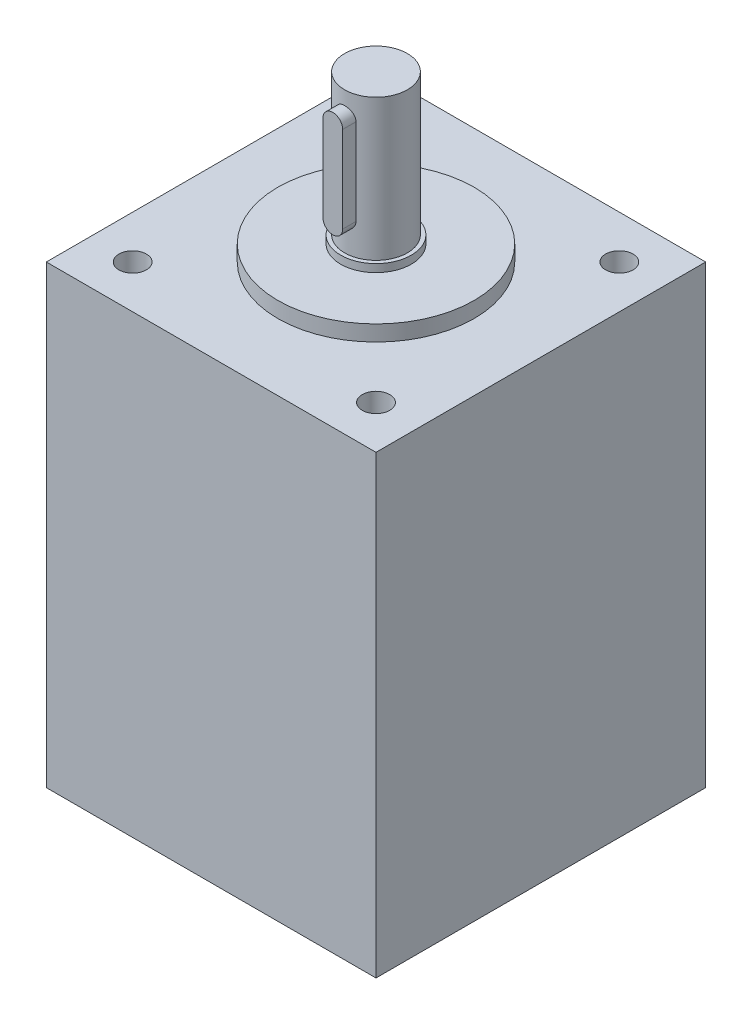
ISO-10303-21;
HEADER;
FILE_DESCRIPTION(('STEP AP214'),'2;1');
FILE_NAME('part.step','',(''),(''),'','','');
FILE_SCHEMA(('AUTOMOTIVE_DESIGN { 1 0 10303 214 1 1 1 1 }'));
ENDSEC;
DATA;
#1=APPLICATION_CONTEXT('core data for automotive mechanical design processes');
#2=APPLICATION_PROTOCOL_DEFINITION('international standard','automotive_design',2000,#1);
#3=PRODUCT_CONTEXT('',#1,'mechanical');
#4=PRODUCT('Part','Part','',(#3));
#5=PRODUCT_RELATED_PRODUCT_CATEGORY('part','',(#4));
#6=PRODUCT_DEFINITION_FORMATION('','',#4);
#7=PRODUCT_DEFINITION_CONTEXT('part definition',#1,'design');
#8=PRODUCT_DEFINITION('design','',#6,#7);
#9=PRODUCT_DEFINITION_SHAPE('','',#8);
#10=(LENGTH_UNIT() NAMED_UNIT(*) SI_UNIT(.MILLI.,.METRE.));
#11=(NAMED_UNIT(*) PLANE_ANGLE_UNIT() SI_UNIT($,.RADIAN.));
#12=(NAMED_UNIT(*) SI_UNIT($,.STERADIAN.) SOLID_ANGLE_UNIT());
#13=UNCERTAINTY_MEASURE_WITH_UNIT(LENGTH_MEASURE(1.E-05),#10,'distance_accuracy_value','');
#14=(GEOMETRIC_REPRESENTATION_CONTEXT(3) GLOBAL_UNCERTAINTY_ASSIGNED_CONTEXT((#13)) GLOBAL_UNIT_ASSIGNED_CONTEXT((#10,
#11,#12)) REPRESENTATION_CONTEXT('',''));
#15=CARTESIAN_POINT('',(0.,0.,0.));
#16=DIRECTION('',(0.,0.,1.));
#17=DIRECTION('',(1.,0.,0.));
#18=AXIS2_PLACEMENT_3D('',#15,#16,#17);
#19=CARTESIAN_POINT('',(0.,58.,0.));
#20=DIRECTION('',(1.,0.,0.));
#21=DIRECTION('',(0.,0.,-1.));
#22=AXIS2_PLACEMENT_3D('',#19,#20,#21);
#23=PLANE('',#22);
#24=DIRECTION('',(0.,0.,1.));
#25=VECTOR('',#24,1.);
#26=CARTESIAN_POINT('',(0.,0.,0.));
#27=LINE('',#26,#25);
#28=CARTESIAN_POINT('',(0.,0.,-42.));
#29=VERTEX_POINT('',#28);
#30=CARTESIAN_POINT('',(0.,0.,0.));
#31=VERTEX_POINT('',#30);
#32=EDGE_CURVE('E164',#29,#31,#27,.T.);
#33=ORIENTED_EDGE('',*,*,#32,.T.);
#34=DIRECTION('',(0.,-1.,0.));
#35=VECTOR('',#34,1.);
#36=CARTESIAN_POINT('',(0.,58.,0.));
#37=LINE('',#36,#35);
#38=CARTESIAN_POINT('',(0.,58.,0.));
#39=VERTEX_POINT('',#38);
#40=EDGE_CURVE('E167',#39,#31,#37,.T.);
#41=ORIENTED_EDGE('',*,*,#40,.F.);
#42=DIRECTION('',(0.,0.,1.));
#43=VECTOR('',#42,1.);
#44=CARTESIAN_POINT('',(0.,58.,0.));
#45=LINE('',#44,#43);
#46=CARTESIAN_POINT('',(0.,58.,-42.));
#47=VERTEX_POINT('',#46);
#48=EDGE_CURVE('E168',#47,#39,#45,.T.);
#49=ORIENTED_EDGE('',*,*,#48,.F.);
#50=DIRECTION('',(0.,-1.,0.));
#51=VECTOR('',#50,1.);
#52=CARTESIAN_POINT('',(0.,58.,-42.));
#53=LINE('',#52,#51);
#54=EDGE_CURVE('E174',#47,#29,#53,.T.);
#55=ORIENTED_EDGE('',*,*,#54,.T.);
#56=EDGE_LOOP('',(#33,#41,#49,#55));
#57=FACE_BOUND('',#56,.T.);
#58=ADVANCED_FACE('F38',(#57),#23,.F.);
#59=CARTESIAN_POINT('',(0.,58.,0.));
#60=DIRECTION('',(0.,0.,-1.));
#61=DIRECTION('',(-1.,0.,0.));
#62=AXIS2_PLACEMENT_3D('',#59,#60,#61);
#63=PLANE('',#62);
#64=DIRECTION('',(1.,0.,0.));
#65=VECTOR('',#64,1.);
#66=CARTESIAN_POINT('',(0.,0.,0.));
#67=LINE('',#66,#65);
#68=CARTESIAN_POINT('',(42.,0.,0.));
#69=VERTEX_POINT('',#68);
#70=EDGE_CURVE('E177',#31,#69,#67,.T.);
#71=ORIENTED_EDGE('',*,*,#70,.T.);
#72=DIRECTION('',(0.,-1.,0.));
#73=VECTOR('',#72,1.);
#74=CARTESIAN_POINT('',(42.,58.,0.));
#75=LINE('',#74,#73);
#76=CARTESIAN_POINT('',(42.,58.,0.));
#77=VERTEX_POINT('',#76);
#78=EDGE_CURVE('E185',#77,#69,#75,.T.);
#79=ORIENTED_EDGE('',*,*,#78,.F.);
#80=DIRECTION('',(1.,0.,0.));
#81=VECTOR('',#80,1.);
#82=CARTESIAN_POINT('',(0.,58.,0.));
#83=LINE('',#82,#81);
#84=EDGE_CURVE('E92',#39,#77,#83,.T.);
#85=ORIENTED_EDGE('',*,*,#84,.F.);
#86=ORIENTED_EDGE('',*,*,#40,.T.);
#87=EDGE_LOOP('',(#71,#79,#85,#86));
#88=FACE_BOUND('',#87,.T.);
#89=ADVANCED_FACE('F251',(#88),#63,.F.);
#90=CARTESIAN_POINT('',(42.,58.,0.));
#91=DIRECTION('',(-1.,0.,0.));
#92=DIRECTION('',(0.,0.,1.));
#93=AXIS2_PLACEMENT_3D('',#90,#91,#92);
#94=PLANE('',#93);
#95=DIRECTION('',(0.,0.,-1.));
#96=VECTOR('',#95,1.);
#97=CARTESIAN_POINT('',(42.,0.,0.));
#98=LINE('',#97,#96);
#99=CARTESIAN_POINT('',(42.,0.,-42.));
#100=VERTEX_POINT('',#99);
#101=EDGE_CURVE('E179',#69,#100,#98,.T.);
#102=ORIENTED_EDGE('',*,*,#101,.T.);
#103=DIRECTION('',(0.,-1.,0.));
#104=VECTOR('',#103,1.);
#105=CARTESIAN_POINT('',(42.,58.,-42.));
#106=LINE('',#105,#104);
#107=CARTESIAN_POINT('',(42.,58.,-42.));
#108=VERTEX_POINT('',#107);
#109=EDGE_CURVE('E183',#108,#100,#106,.T.);
#110=ORIENTED_EDGE('',*,*,#109,.F.);
#111=DIRECTION('',(0.,0.,-1.));
#112=VECTOR('',#111,1.);
#113=CARTESIAN_POINT('',(42.,58.,0.));
#114=LINE('',#113,#112);
#115=EDGE_CURVE('E171',#77,#108,#114,.T.);
#116=ORIENTED_EDGE('',*,*,#115,.F.);
#117=ORIENTED_EDGE('',*,*,#78,.T.);
#118=EDGE_LOOP('',(#102,#110,#116,#117));
#119=FACE_BOUND('',#118,.T.);
#120=ADVANCED_FACE('F250',(#119),#94,.F.);
#121=CARTESIAN_POINT('',(0.,58.,-42.));
#122=DIRECTION('',(0.,0.,1.));
#123=DIRECTION('',(1.,0.,0.));
#124=AXIS2_PLACEMENT_3D('',#121,#122,#123);
#125=PLANE('',#124);
#126=DIRECTION('',(-1.,0.,0.));
#127=VECTOR('',#126,1.);
#128=CARTESIAN_POINT('',(0.,0.,-42.));
#129=LINE('',#128,#127);
#130=EDGE_CURVE('E84',#100,#29,#129,.T.);
#131=ORIENTED_EDGE('',*,*,#130,.T.);
#132=ORIENTED_EDGE('',*,*,#54,.F.);
#133=DIRECTION('',(-1.,0.,0.));
#134=VECTOR('',#133,1.);
#135=CARTESIAN_POINT('',(0.,58.,-42.));
#136=LINE('',#135,#134);
#137=EDGE_CURVE('E63',#108,#47,#136,.T.);
#138=ORIENTED_EDGE('',*,*,#137,.F.);
#139=ORIENTED_EDGE('',*,*,#109,.T.);
#140=EDGE_LOOP('',(#131,#132,#138,#139));
#141=FACE_BOUND('',#140,.T.);
#142=ADVANCED_FACE('F246',(#141),#125,.F.);
#143=CARTESIAN_POINT('',(0.,58.,0.));
#144=DIRECTION('',(0.,-1.,0.));
#145=DIRECTION('',(0.,0.,-1.));
#146=AXIS2_PLACEMENT_3D('',#143,#144,#145);
#147=PLANE('',#146);
#148=CARTESIAN_POINT('',(5.5,58.,-5.50000000000001));
#149=DIRECTION('',(0.,1.,0.));
#150=DIRECTION('',(0.,0.,-1.));
#151=AXIS2_PLACEMENT_3D('',#148,#149,#150);
#152=CIRCLE('',#151,1.75);
#153=CARTESIAN_POINT('',(5.5,58.,-7.25000000000001));
#154=VERTEX_POINT('',#153);
#155=EDGE_CURVE('E483',#154,#154,#152,.T.);
#156=ORIENTED_EDGE('',*,*,#155,.F.);
#157=EDGE_LOOP('',(#156));
#158=FACE_BOUND('',#157,.T.);
#159=CARTESIAN_POINT('',(36.5,58.,-5.50000000000001));
#160=DIRECTION('',(0.,1.,0.));
#161=DIRECTION('',(0.,0.,1.));
#162=AXIS2_PLACEMENT_3D('',#159,#160,#161);
#163=CIRCLE('',#162,1.75);
#164=CARTESIAN_POINT('',(36.5,58.,-3.75000000000001));
#165=VERTEX_POINT('',#164);
#166=EDGE_CURVE('E484',#165,#165,#163,.T.);
#167=ORIENTED_EDGE('',*,*,#166,.F.);
#168=EDGE_LOOP('',(#167));
#169=FACE_BOUND('',#168,.T.);
#170=CARTESIAN_POINT('',(36.5,58.,-36.5));
#171=DIRECTION('',(0.,1.,0.));
#172=DIRECTION('',(0.,0.,-1.));
#173=AXIS2_PLACEMENT_3D('',#170,#171,#172);
#174=CIRCLE('',#173,1.75);
#175=CARTESIAN_POINT('',(36.5,58.,-38.25));
#176=VERTEX_POINT('',#175);
#177=EDGE_CURVE('E486',#176,#176,#174,.T.);
#178=ORIENTED_EDGE('',*,*,#177,.F.);
#179=EDGE_LOOP('',(#178));
#180=FACE_BOUND('',#179,.T.);
#181=CARTESIAN_POINT('',(5.5,58.,-36.5));
#182=DIRECTION('',(0.,1.,0.));
#183=DIRECTION('',(0.,0.,1.));
#184=AXIS2_PLACEMENT_3D('',#181,#182,#183);
#185=CIRCLE('',#184,1.75);
#186=CARTESIAN_POINT('',(5.5,58.,-34.75));
#187=VERTEX_POINT('',#186);
#188=EDGE_CURVE('E137',#187,#187,#185,.T.);
#189=ORIENTED_EDGE('',*,*,#188,.F.);
#190=EDGE_LOOP('',(#189));
#191=FACE_BOUND('',#190,.T.);
#192=CARTESIAN_POINT('',(21.,58.,-21.));
#193=DIRECTION('',(0.,1.,0.));
#194=DIRECTION('',(0.,0.,1.));
#195=AXIS2_PLACEMENT_3D('',#192,#193,#194);
#196=CIRCLE('',#195,12.5);
#197=CARTESIAN_POINT('',(21.,58.,-8.50000000000001));
#198=VERTEX_POINT('',#197);
#199=EDGE_CURVE('E161',#198,#198,#196,.T.);
#200=ORIENTED_EDGE('',*,*,#199,.F.);
#201=EDGE_LOOP('',(#200));
#202=FACE_BOUND('',#201,.T.);
#203=ORIENTED_EDGE('',*,*,#48,.T.);
#204=ORIENTED_EDGE('',*,*,#84,.T.);
#205=ORIENTED_EDGE('',*,*,#115,.T.);
#206=ORIENTED_EDGE('',*,*,#137,.T.);
#207=EDGE_LOOP('',(#203,#204,#205,#206));
#208=FACE_BOUND('',#207,.T.);
#209=ADVANCED_FACE('F234',(#158,#169,#180,#191,#202,#208),#147,.F.);
#210=CARTESIAN_POINT('',(0.,0.,0.));
#211=DIRECTION('',(0.,-1.,0.));
#212=DIRECTION('',(0.,0.,-1.));
#213=AXIS2_PLACEMENT_3D('',#210,#211,#212);
#214=PLANE('',#213);
#215=CARTESIAN_POINT('',(5.5,0.,-5.50000000000001));
#216=DIRECTION('',(0.,-1.,0.));
#217=DIRECTION('',(0.,0.,-1.));
#218=AXIS2_PLACEMENT_3D('',#215,#216,#217);
#219=CIRCLE('',#218,1.75);
#220=CARTESIAN_POINT('',(5.5,0.,-7.25000000000001));
#221=VERTEX_POINT('',#220);
#222=EDGE_CURVE('E41',#221,#221,#219,.T.);
#223=ORIENTED_EDGE('',*,*,#222,.F.);
#224=EDGE_LOOP('',(#223));
#225=FACE_BOUND('',#224,.T.);
#226=CARTESIAN_POINT('',(36.5,0.,-5.50000000000001));
#227=DIRECTION('',(0.,-1.,0.));
#228=DIRECTION('',(0.,0.,-1.));
#229=AXIS2_PLACEMENT_3D('',#226,#227,#228);
#230=CIRCLE('',#229,1.75);
#231=CARTESIAN_POINT('',(36.5,0.,-7.25000000000002));
#232=VERTEX_POINT('',#231);
#233=EDGE_CURVE('E135',#232,#232,#230,.T.);
#234=ORIENTED_EDGE('',*,*,#233,.F.);
#235=EDGE_LOOP('',(#234));
#236=FACE_BOUND('',#235,.T.);
#237=CARTESIAN_POINT('',(36.5,0.,-36.5));
#238=DIRECTION('',(0.,-1.,0.));
#239=DIRECTION('',(0.,0.,-1.));
#240=AXIS2_PLACEMENT_3D('',#237,#238,#239);
#241=CIRCLE('',#240,1.75);
#242=CARTESIAN_POINT('',(36.5,0.,-38.25));
#243=VERTEX_POINT('',#242);
#244=EDGE_CURVE('E222',#243,#243,#241,.T.);
#245=ORIENTED_EDGE('',*,*,#244,.F.);
#246=EDGE_LOOP('',(#245));
#247=FACE_BOUND('',#246,.T.);
#248=CARTESIAN_POINT('',(5.5,0.,-36.5));
#249=DIRECTION('',(0.,-1.,0.));
#250=DIRECTION('',(0.,0.,-1.));
#251=AXIS2_PLACEMENT_3D('',#248,#249,#250);
#252=CIRCLE('',#251,1.75);
#253=CARTESIAN_POINT('',(5.5,0.,-38.25));
#254=VERTEX_POINT('',#253);
#255=EDGE_CURVE('E219',#254,#254,#252,.T.);
#256=ORIENTED_EDGE('',*,*,#255,.F.);
#257=EDGE_LOOP('',(#256));
#258=FACE_BOUND('',#257,.T.);
#259=ORIENTED_EDGE('',*,*,#32,.F.);
#260=ORIENTED_EDGE('',*,*,#130,.F.);
#261=ORIENTED_EDGE('',*,*,#101,.F.);
#262=ORIENTED_EDGE('',*,*,#70,.F.);
#263=EDGE_LOOP('',(#259,#260,#261,#262));
#264=FACE_BOUND('',#263,.T.);
#265=ADVANCED_FACE('F230',(#225,#236,#247,#258,#264),#214,.T.);
#266=CARTESIAN_POINT('',(21.,60.,-21.));
#267=DIRECTION('',(0.,-1.,0.));
#268=DIRECTION('',(0.,0.,-1.));
#269=AXIS2_PLACEMENT_3D('',#266,#267,#268);
#270=CYLINDRICAL_SURFACE('',#269,12.5);
#271=CARTESIAN_POINT('',(21.,60.,-21.));
#272=DIRECTION('',(0.,1.,0.));
#273=DIRECTION('',(0.,0.,1.));
#274=AXIS2_PLACEMENT_3D('',#271,#272,#273);
#275=CIRCLE('',#274,12.5);
#276=CARTESIAN_POINT('',(21.,60.,-8.50000000000001));
#277=VERTEX_POINT('',#276);
#278=EDGE_CURVE('E158',#277,#277,#275,.T.);
#279=ORIENTED_EDGE('',*,*,#278,.F.);
#280=EDGE_LOOP('',(#279));
#281=FACE_BOUND('',#280,.T.);
#282=ORIENTED_EDGE('',*,*,#199,.T.);
#283=EDGE_LOOP('',(#282));
#284=FACE_BOUND('',#283,.T.);
#285=ADVANCED_FACE('F233',(#281,#284),#270,.T.);
#286=CARTESIAN_POINT('',(21.,60.,-21.));
#287=DIRECTION('',(0.,1.,0.));
#288=DIRECTION('',(0.,0.,1.));
#289=AXIS2_PLACEMENT_3D('',#286,#287,#288);
#290=PLANE('',#289);
#291=CARTESIAN_POINT('',(21.,60.,-21.));
#292=DIRECTION('',(0.,1.,0.));
#293=DIRECTION('',(0.,0.,1.));
#294=AXIS2_PLACEMENT_3D('',#291,#292,#293);
#295=CIRCLE('',#294,4.5);
#296=CARTESIAN_POINT('',(21.,60.,-16.5));
#297=VERTEX_POINT('',#296);
#298=EDGE_CURVE('E155',#297,#297,#295,.T.);
#299=ORIENTED_EDGE('',*,*,#298,.F.);
#300=EDGE_LOOP('',(#299));
#301=FACE_BOUND('',#300,.T.);
#302=ORIENTED_EDGE('',*,*,#278,.T.);
#303=EDGE_LOOP('',(#302));
#304=FACE_BOUND('',#303,.T.);
#305=ADVANCED_FACE('F266',(#301,#304),#290,.T.);
#306=CARTESIAN_POINT('',(21.,61.,-21.));
#307=DIRECTION('',(0.,-1.,0.));
#308=DIRECTION('',(0.,0.,-1.));
#309=AXIS2_PLACEMENT_3D('',#306,#307,#308);
#310=CYLINDRICAL_SURFACE('',#309,4.5);
#311=CARTESIAN_POINT('',(21.,61.,-21.));
#312=DIRECTION('',(0.,1.,0.));
#313=DIRECTION('',(0.,0.,1.));
#314=AXIS2_PLACEMENT_3D('',#311,#312,#313);
#315=CIRCLE('',#314,4.5);
#316=CARTESIAN_POINT('',(21.,61.,-16.5));
#317=VERTEX_POINT('',#316);
#318=EDGE_CURVE('E150',#317,#317,#315,.T.);
#319=ORIENTED_EDGE('',*,*,#318,.F.);
#320=EDGE_LOOP('',(#319));
#321=FACE_BOUND('',#320,.T.);
#322=ORIENTED_EDGE('',*,*,#298,.T.);
#323=EDGE_LOOP('',(#322));
#324=FACE_BOUND('',#323,.T.);
#325=ADVANCED_FACE('F270',(#321,#324),#310,.T.);
#326=CARTESIAN_POINT('',(21.,61.,-21.));
#327=DIRECTION('',(0.,1.,0.));
#328=DIRECTION('',(0.,0.,1.));
#329=AXIS2_PLACEMENT_3D('',#326,#327,#328);
#330=PLANE('',#329);
#331=CARTESIAN_POINT('',(21.,61.,-21.));
#332=DIRECTION('',(0.,1.,0.));
#333=DIRECTION('',(0.,0.,1.));
#334=AXIS2_PLACEMENT_3D('',#331,#332,#333);
#335=CIRCLE('',#334,4.);
#336=CARTESIAN_POINT('',(21.,61.,-17.));
#337=VERTEX_POINT('',#336);
#338=EDGE_CURVE('E151',#337,#337,#335,.T.);
#339=ORIENTED_EDGE('',*,*,#338,.F.);
#340=EDGE_LOOP('',(#339));
#341=FACE_BOUND('',#340,.T.);
#342=ORIENTED_EDGE('',*,*,#318,.T.);
#343=EDGE_LOOP('',(#342));
#344=FACE_BOUND('',#343,.T.);
#345=ADVANCED_FACE('F273',(#341,#344),#330,.T.);
#346=CARTESIAN_POINT('',(21.,79.,-21.));
#347=DIRECTION('',(0.,-1.,0.));
#348=DIRECTION('',(0.,0.,-1.));
#349=AXIS2_PLACEMENT_3D('',#346,#347,#348);
#350=CYLINDRICAL_SURFACE('',#349,4.);
#351=DIRECTION('',(0.,-1.,0.));
#352=VECTOR('',#351,1.);
#353=CARTESIAN_POINT('',(19.7451485693752,79.,-17.2019283989031));
#354=LINE('',#353,#352);
#355=CARTESIAN_POINT('',(19.7451485693752,65.,-17.2019283989031));
#356=VERTEX_POINT('',#355);
#357=CARTESIAN_POINT('',(19.7451485693752,76.,-17.2019283989031));
#358=VERTEX_POINT('',#357);
#359=EDGE_CURVE('E154',#356,#358,#354,.F.);
#360=ORIENTED_EDGE('',*,*,#359,.T.);
#361=CARTESIAN_POINT('',(22.2548514306248,76.,-17.2019283989031));
#362=CARTESIAN_POINT('',(22.2548510076971,75.9314025017575,-17.2019280077231));
#363=CARTESIAN_POINT('',(22.2492074284182,75.8628006628783,-17.2000496435417));
#364=CARTESIAN_POINT('',(22.2268474559461,75.7276133721323,-17.1927726795756));
#365=CARTESIAN_POINT('',(22.2101281390364,75.6610284575376,-17.1873731502975));
#366=CARTESIAN_POINT('',(22.1662489106781,75.5318528530891,-17.1737243018151));
#367=CARTESIAN_POINT('',(22.1391075850232,75.4692552828904,-17.1654800582899));
#368=CARTESIAN_POINT('',(22.0752168839291,75.3494845430403,-17.1470777698554));
#369=CARTESIAN_POINT('',(22.0384657861454,75.2923123482766,-17.1369193819683));
#370=CARTESIAN_POINT('',(21.9550361559735,75.1830359044051,-17.1154389447144));
#371=CARTESIAN_POINT('',(21.9080821753213,75.1311471150295,-17.1040903747683));
#372=CARTESIAN_POINT('',(21.8061689498582,75.0358358278152,-17.0817338479075));
#373=CARTESIAN_POINT('',(21.7512085800784,74.9924145217415,-17.0707259391227));
#374=CARTESIAN_POINT('',(21.6332928394617,74.9143184815162,-17.0499874575148));
#375=CARTESIAN_POINT('',(21.5701836942455,74.8798658565649,-17.0402917494172));
#376=CARTESIAN_POINT('',(21.4387106836485,74.8221479407846,-17.0235799666477));
#377=CARTESIAN_POINT('',(21.3703480679716,74.7988799988219,-17.0165632570474));
#378=CARTESIAN_POINT('',(21.2325648254133,74.7649119803921,-17.0061877891637));
#379=CARTESIAN_POINT('',(21.1632431993916,74.7538435991747,-17.0027220699658));
#380=CARTESIAN_POINT('',(21.0236459387936,74.7434217159415,-16.999461199698));
#381=CARTESIAN_POINT('',(20.9533705264032,74.744065530816,-16.999665207942));
#382=CARTESIAN_POINT('',(20.8164535609773,74.756807970105,-17.0036464425257));
#383=CARTESIAN_POINT('',(20.7497706445706,74.7685072917916,-17.0072991063602));
#384=CARTESIAN_POINT('',(20.6193674707329,74.8023731692894,-17.0176138544112));
#385=CARTESIAN_POINT('',(20.5556474073189,74.8245404095161,-17.0242761354017));
#386=CARTESIAN_POINT('',(20.432060158524,74.8789680950992,-17.0400282618756));
#387=CARTESIAN_POINT('',(20.3722499759235,74.9113492841755,-17.0491469468435));
#388=CARTESIAN_POINT('',(20.2587884107593,74.9851886756804,-17.0688517778303));
#389=CARTESIAN_POINT('',(20.2051386001482,75.0266491870835,-17.0794382968843));
#390=CARTESIAN_POINT('',(20.1031400182846,75.1195182445489,-17.1014771269303));
#391=CARTESIAN_POINT('',(20.055108359805,75.1712713601979,-17.1129471269657));
#392=CARTESIAN_POINT('',(19.9683107849442,75.2822046100731,-17.1350771168726));
#393=CARTESIAN_POINT('',(19.9295459776963,75.3413856320411,-17.1457370096797));
#394=CARTESIAN_POINT('',(19.8620096670831,75.4663968644005,-17.1651295014488));
#395=CARTESIAN_POINT('',(19.8333565281485,75.5322948931996,-17.1738388630348));
#396=CARTESIAN_POINT('',(19.7876538502749,75.6683198209031,-17.1880718212862));
#397=CARTESIAN_POINT('',(19.770600103765,75.7384451763252,-17.193596573028));
#398=CARTESIAN_POINT('',(19.749194000783,75.877894044525,-17.2005781028202));
#399=CARTESIAN_POINT('',(19.7443556979977,75.9471352187903,-17.2021904158905));
#400=CARTESIAN_POINT('',(19.746152925018,76.0854451603328,-17.2015965125429));
#401=CARTESIAN_POINT('',(19.7527866649873,76.1545139528208,-17.1993908917885));
#402=CARTESIAN_POINT('',(19.776905245254,76.2884197871557,-17.1915632820957));
#403=CARTESIAN_POINT('',(19.7940674212281,76.3533215080429,-17.1860429809193));
#404=CARTESIAN_POINT('',(19.8383763975075,76.4793165771696,-17.1723159824303));
#405=CARTESIAN_POINT('',(19.8655248346307,76.5404092991666,-17.1641088447509));
#406=CARTESIAN_POINT('',(19.9299295046433,76.6590033055538,-17.1456389428064));
#407=CARTESIAN_POINT('',(19.9674548061946,76.7163500822858,-17.1353236945109));
#408=CARTESIAN_POINT('',(20.0512344075225,76.824109596224,-17.1139081134519));
#409=CARTESIAN_POINT('',(20.0974909923903,76.8745205122398,-17.1028075756446));
#410=CARTESIAN_POINT('',(20.1997207128226,76.9691520380372,-17.0805105083099));
#411=CARTESIAN_POINT('',(20.2560192664983,77.0130256571187,-17.069329374103));
#412=CARTESIAN_POINT('',(20.3754503269506,77.0907169550484,-17.0485944700002));
#413=CARTESIAN_POINT('',(20.4385825236713,77.124535089873,-17.0390406263216));
#414=CARTESIAN_POINT('',(20.5695034918161,77.1808315622422,-17.0226908626561));
#415=CARTESIAN_POINT('',(20.6372545091695,77.2033916487806,-17.0158751329105));
#416=CARTESIAN_POINT('',(20.7758408653886,77.236721343425,-17.0056824773655));
#417=CARTESIAN_POINT('',(20.8466752234608,77.2474946727442,-17.0023044662628));
#418=CARTESIAN_POINT('',(20.9862246139922,77.2566408687772,-16.9994403370757));
#419=CARTESIAN_POINT('',(21.0549039679829,77.2555147645122,-16.9997969650812));
#420=CARTESIAN_POINT('',(21.1910506492713,77.2421070599648,-17.0039847833683));
#421=CARTESIAN_POINT('',(21.2585180563407,77.2298261966646,-17.0078157441045));
#422=CARTESIAN_POINT('',(21.3894838197575,77.1947774241575,-17.0184715606523));
#423=CARTESIAN_POINT('',(21.4530216745938,77.1721445537192,-17.025257812596));
#424=CARTESIAN_POINT('',(21.5754284967597,77.1171563652379,-17.0411244598342));
#425=CARTESIAN_POINT('',(21.6342966581051,77.0847993734165,-17.0502052500366));
#426=CARTESIAN_POINT('',(21.7478776277273,77.0100056062433,-17.0700994405475));
#427=CARTESIAN_POINT('',(21.8023802756065,76.9672627253126,-17.0809613650403));
#428=CARTESIAN_POINT('',(21.9036055976567,76.8734492709564,-17.1030542309684));
#429=CARTESIAN_POINT('',(21.9503259267689,76.8223761965225,-17.1142852824171));
#430=CARTESIAN_POINT('',(22.0362388012747,76.7113037862435,-17.1362913214459));
#431=CARTESIAN_POINT('',(22.0751271052061,76.6510629291876,-17.147038468921));
#432=CARTESIAN_POINT('',(22.1421863838066,76.5245770440211,-17.1663809587386));
#433=CARTESIAN_POINT('',(22.1703616100532,76.4583344107186,-17.174977154241));
#434=CARTESIAN_POINT('',(22.213186728485,76.3273761895562,-17.1883546710163));
#435=CARTESIAN_POINT('',(22.2287648079051,76.2629898639875,-17.1933933222814));
#436=CARTESIAN_POINT('',(22.2495960656978,76.1324033998949,-17.2001799615079));
#437=CARTESIAN_POINT('',(22.2548518387942,76.066203721438,-17.2019287764326));
#438=CARTESIAN_POINT('',(22.2548514306248,76.,-17.2019283989031));
#439=B_SPLINE_CURVE_WITH_KNOTS('',3,(#361,#362,#363,#364,#365,#366,#367,#368,#369,#370,#371,
#372,#373,#374,#375,#376,#377,#378,#379,#380,#381,#382,#383,#384,#385,#386,#387,#388,#389,#390,
#391,#392,#393,#394,#395,#396,#397,#398,#399,#400,#401,#402,#403,#404,#405,#406,#407,#408,#409,
#410,#411,#412,#413,#414,#415,#416,#417,#418,#419,#420,#421,#422,#423,#424,#425,#426,#427,#428,
#429,#430,#431,#432,#433,#434,#435,#436,#437,#438),.UNSPECIFIED.,.T.,.F.,(4,2,2,2,2,2,2,2,2,2,2,
2,2,2,2,2,2,2,2,2,2,2,2,2,2,2,2,2,2,2,2,2,2,2,2,2,2,2,4),(0.,0.205547907287991,
0.411150095691636,0.616387319412504,0.821661352726282,1.03337996507,1.24512835450256,
1.46170688178864,1.67823404757303,1.8880282091795,2.09777431031727,2.30022315004717,
2.50268522816052,2.70763655035462,2.91264005464588,3.12625017021235,3.33988583961746,
3.55594522568433,3.77192619637699,3.97916923987075,4.18637995280127,4.38753723665012,
4.58872750628429,4.79572341095838,5.00277356447217,5.21848151715834,5.43417968685104,
5.64828793055633,5.86232855833277,6.06739411849258,6.27244613118721,6.47489640423646,
6.67738154430628,6.88677168468945,7.09622480725021,7.31268731379779,7.52906382544084,
7.72748882201965,7.92586393401221),.UNSPECIFIED.);
#440=CARTESIAN_POINT('',(22.2548514306248,76.,-17.2019283989031));
#441=VERTEX_POINT('',#440);
#442=EDGE_CURVE('E11',#358,#441,#439,.T.);
#443=ORIENTED_EDGE('',*,*,#442,.T.);
#444=DIRECTION('',(0.,-1.,0.));
#445=VECTOR('',#444,1.);
#446=CARTESIAN_POINT('',(22.2548514306248,79.,-17.2019283989031));
#447=LINE('',#446,#445);
#448=CARTESIAN_POINT('',(22.2548514306248,65.,-17.2019283989031));
#449=VERTEX_POINT('',#448);
#450=EDGE_CURVE('E46',#441,#449,#447,.T.);
#451=ORIENTED_EDGE('',*,*,#450,.T.);
#452=CARTESIAN_POINT('',(22.2548514306248,65.,-17.2019283989031));
#453=CARTESIAN_POINT('',(22.2548510076971,64.9314025017576,-17.2019280077231));
#454=CARTESIAN_POINT('',(22.2492074284182,64.8628006628783,-17.2000496435417));
#455=CARTESIAN_POINT('',(22.2268474559461,64.7276133721323,-17.1927726795756));
#456=CARTESIAN_POINT('',(22.2101281390364,64.6610284575376,-17.1873731502975));
#457=CARTESIAN_POINT('',(22.1662489106781,64.5318528530891,-17.1737243018151));
#458=CARTESIAN_POINT('',(22.1391075850232,64.4692552828904,-17.1654800582899));
#459=CARTESIAN_POINT('',(22.0752168839291,64.3494845430403,-17.1470777698554));
#460=CARTESIAN_POINT('',(22.0384657861454,64.2923123482766,-17.1369193819683));
#461=CARTESIAN_POINT('',(21.9550361559735,64.1830359044051,-17.1154389447144));
#462=CARTESIAN_POINT('',(21.9080821753213,64.1311471150295,-17.1040903747683));
#463=CARTESIAN_POINT('',(21.8061689498582,64.0358358278152,-17.0817338479075));
#464=CARTESIAN_POINT('',(21.7512085800784,63.9924145217415,-17.0707259391227));
#465=CARTESIAN_POINT('',(21.6332928394617,63.9143184815163,-17.0499874575148));
#466=CARTESIAN_POINT('',(21.5701836942455,63.8798658565649,-17.0402917494172));
#467=CARTESIAN_POINT('',(21.4387106836485,63.8221479407846,-17.0235799666477));
#468=CARTESIAN_POINT('',(21.3703480679716,63.7988799988219,-17.0165632570474));
#469=CARTESIAN_POINT('',(21.2325648254133,63.7649119803921,-17.0061877891637));
#470=CARTESIAN_POINT('',(21.1632431993916,63.7538435991747,-17.0027220699658));
#471=CARTESIAN_POINT('',(21.0236459387936,63.7434217159415,-16.999461199698));
#472=CARTESIAN_POINT('',(20.9533705264032,63.744065530816,-16.999665207942));
#473=CARTESIAN_POINT('',(20.8164535609773,63.756807970105,-17.0036464425257));
#474=CARTESIAN_POINT('',(20.7497706445706,63.7685072917916,-17.0072991063602));
#475=CARTESIAN_POINT('',(20.6193674707329,63.8023731692894,-17.0176138544112));
#476=CARTESIAN_POINT('',(20.5556474073189,63.8245404095161,-17.0242761354017));
#477=CARTESIAN_POINT('',(20.432060158524,63.8789680950992,-17.0400282618756));
#478=CARTESIAN_POINT('',(20.3722499759235,63.9113492841755,-17.0491469468435));
#479=CARTESIAN_POINT('',(20.2587884107593,63.9851886756804,-17.0688517778303));
#480=CARTESIAN_POINT('',(20.2051386001482,64.0266491870835,-17.0794382968843));
#481=CARTESIAN_POINT('',(20.1031400182846,64.1195182445489,-17.1014771269303));
#482=CARTESIAN_POINT('',(20.0551083598051,64.1712713601979,-17.1129471269657));
#483=CARTESIAN_POINT('',(19.9683107849442,64.2822046100731,-17.1350771168726));
#484=CARTESIAN_POINT('',(19.9295459776963,64.3413856320411,-17.1457370096797));
#485=CARTESIAN_POINT('',(19.8620096670831,64.4663968644005,-17.1651295014488));
#486=CARTESIAN_POINT('',(19.8333565281485,64.5322948931996,-17.1738388630348));
#487=CARTESIAN_POINT('',(19.7876538502749,64.6683198209031,-17.1880718212862));
#488=CARTESIAN_POINT('',(19.770600103765,64.7384451763252,-17.193596573028));
#489=CARTESIAN_POINT('',(19.749194000783,64.877894044525,-17.2005781028202));
#490=CARTESIAN_POINT('',(19.7443556979977,64.9471352187903,-17.2021904158905));
#491=CARTESIAN_POINT('',(19.746152925018,65.0854451603328,-17.2015965125429));
#492=CARTESIAN_POINT('',(19.7527866649874,65.1545139528208,-17.1993908917885));
#493=CARTESIAN_POINT('',(19.776905245254,65.2884197871557,-17.1915632820957));
#494=CARTESIAN_POINT('',(19.7940674212281,65.3533215080429,-17.1860429809193));
#495=CARTESIAN_POINT('',(19.8383763975075,65.4793165771696,-17.1723159824303));
#496=CARTESIAN_POINT('',(19.8655248346307,65.5404092991666,-17.1641088447509));
#497=CARTESIAN_POINT('',(19.9299295046433,65.6590033055538,-17.1456389428064));
#498=CARTESIAN_POINT('',(19.9674548061946,65.7163500822859,-17.1353236945109));
#499=CARTESIAN_POINT('',(20.0512344075225,65.824109596224,-17.1139081134519));
#500=CARTESIAN_POINT('',(20.0974909923903,65.8745205122398,-17.1028075756446));
#501=CARTESIAN_POINT('',(20.1997207128226,65.9691520380372,-17.0805105083099));
#502=CARTESIAN_POINT('',(20.2560192664983,66.0130256571187,-17.069329374103));
#503=CARTESIAN_POINT('',(20.3754503269506,66.0907169550484,-17.0485944700002));
#504=CARTESIAN_POINT('',(20.4385825236713,66.124535089873,-17.0390406263216));
#505=CARTESIAN_POINT('',(20.5695034918161,66.1808315622422,-17.0226908626561));
#506=CARTESIAN_POINT('',(20.6372545091695,66.2033916487806,-17.0158751329105));
#507=CARTESIAN_POINT('',(20.7758408653886,66.236721343425,-17.0056824773655));
#508=CARTESIAN_POINT('',(20.8466752234608,66.2474946727442,-17.0023044662628));
#509=CARTESIAN_POINT('',(20.9862246139922,66.2566408687772,-16.9994403370757));
#510=CARTESIAN_POINT('',(21.0549039679829,66.2555147645122,-16.9997969650812));
#511=CARTESIAN_POINT('',(21.1910506492713,66.2421070599648,-17.0039847833683));
#512=CARTESIAN_POINT('',(21.2585180563407,66.2298261966646,-17.0078157441045));
#513=CARTESIAN_POINT('',(21.3894838197575,66.1947774241575,-17.0184715606523));
#514=CARTESIAN_POINT('',(21.4530216745938,66.1721445537192,-17.025257812596));
#515=CARTESIAN_POINT('',(21.5754284967597,66.1171563652379,-17.0411244598342));
#516=CARTESIAN_POINT('',(21.6342966581051,66.0847993734165,-17.0502052500366));
#517=CARTESIAN_POINT('',(21.7478776277273,66.0100056062433,-17.0700994405475));
#518=CARTESIAN_POINT('',(21.8023802756065,65.9672627253126,-17.0809613650403));
#519=CARTESIAN_POINT('',(21.9036055976567,65.8734492709564,-17.1030542309684));
#520=CARTESIAN_POINT('',(21.9503259267689,65.8223761965225,-17.1142852824171));
#521=CARTESIAN_POINT('',(22.0362388012747,65.7113037862435,-17.1362913214459));
#522=CARTESIAN_POINT('',(22.0751271052061,65.6510629291876,-17.147038468921));
#523=CARTESIAN_POINT('',(22.1421863838066,65.5245770440211,-17.1663809587386));
#524=CARTESIAN_POINT('',(22.1703616100532,65.4583344107186,-17.174977154241));
#525=CARTESIAN_POINT('',(22.213186728485,65.3273761895562,-17.1883546710163));
#526=CARTESIAN_POINT('',(22.2287648079051,65.2629898639875,-17.1933933222814));
#527=CARTESIAN_POINT('',(22.2495960656978,65.132403399895,-17.2001799615079));
#528=CARTESIAN_POINT('',(22.2548518387942,65.066203721438,-17.2019287764326));
#529=CARTESIAN_POINT('',(22.2548514306248,65.,-17.2019283989031));
#530=B_SPLINE_CURVE_WITH_KNOTS('',3,(#452,#453,#454,#455,#456,#457,#458,#459,#460,#461,#462,
#463,#464,#465,#466,#467,#468,#469,#470,#471,#472,#473,#474,#475,#476,#477,#478,#479,#480,#481,
#482,#483,#484,#485,#486,#487,#488,#489,#490,#491,#492,#493,#494,#495,#496,#497,#498,#499,#500,
#501,#502,#503,#504,#505,#506,#507,#508,#509,#510,#511,#512,#513,#514,#515,#516,#517,#518,#519,
#520,#521,#522,#523,#524,#525,#526,#527,#528,#529),.UNSPECIFIED.,.T.,.F.,(4,2,2,2,2,2,2,2,2,2,2,
2,2,2,2,2,2,2,2,2,2,2,2,2,2,2,2,2,2,2,2,2,2,2,2,2,2,2,4),(0.,0.205547907287977,
0.411150095691636,0.616387319412519,0.821661352726282,1.03337996507,1.24512835450256,
1.46170688178864,1.67823404757303,1.88802820917949,2.09777431031726,2.30022315004717,
2.50268522816051,2.70763655035462,2.91264005464587,3.12625017021234,3.33988583961746,
3.55594522568433,3.77192619637699,3.97916923987076,4.18637995280126,4.3875372366501,
4.58872750628428,4.79572341095837,5.00277356447216,5.21848151715833,5.43417968685104,
5.64828793055633,5.86232855833276,6.06739411849257,6.27244613118721,6.47489640423646,
6.67738154430627,6.88677168468944,7.09622480725021,7.31268731379778,7.52906382544083,
7.72748882201963,7.92586393401221),.UNSPECIFIED.);
#531=EDGE_CURVE('E190',#449,#356,#530,.T.);
#532=ORIENTED_EDGE('',*,*,#531,.T.);
#533=EDGE_LOOP('',(#360,#443,#451,#532));
#534=FACE_BOUND('',#533,.T.);
#535=CARTESIAN_POINT('',(21.,79.,-21.));
#536=DIRECTION('',(0.,1.,0.));
#537=DIRECTION('',(0.,0.,1.));
#538=AXIS2_PLACEMENT_3D('',#535,#536,#537);
#539=CIRCLE('',#538,4.);
#540=CARTESIAN_POINT('',(21.,79.,-17.));
#541=VERTEX_POINT('',#540);
#542=EDGE_CURVE('E144',#541,#541,#539,.T.);
#543=ORIENTED_EDGE('',*,*,#542,.F.);
#544=EDGE_LOOP('',(#543));
#545=FACE_BOUND('',#544,.T.);
#546=ORIENTED_EDGE('',*,*,#338,.T.);
#547=EDGE_LOOP('',(#546));
#548=FACE_BOUND('',#547,.T.);
#549=ADVANCED_FACE('F198',(#534,#545,#548),#350,.T.);
#550=CARTESIAN_POINT('',(21.,79.,-21.));
#551=DIRECTION('',(0.,1.,0.));
#552=DIRECTION('',(0.,0.,1.));
#553=AXIS2_PLACEMENT_3D('',#550,#551,#552);
#554=PLANE('',#553);
#555=ORIENTED_EDGE('',*,*,#542,.T.);
#556=EDGE_LOOP('',(#555));
#557=FACE_BOUND('',#556,.T.);
#558=ADVANCED_FACE('F214',(#557),#554,.T.);
#559=CARTESIAN_POINT('',(21.,76.,-21.));
#560=DIRECTION('',(0.,0.,1.));
#561=DIRECTION('',(1.,0.,0.));
#562=AXIS2_PLACEMENT_3D('',#559,#560,#561);
#563=CYLINDRICAL_SURFACE('',#562,1.25485143062484);
#564=ORIENTED_EDGE('',*,*,#442,.F.);
#565=DIRECTION('',(0.,0.,1.));
#566=VECTOR('',#565,1.);
#567=CARTESIAN_POINT('',(19.7451485693752,76.,-21.));
#568=LINE('',#567,#566);
#569=CARTESIAN_POINT('',(19.7451485693752,76.,-15.5));
#570=VERTEX_POINT('',#569);
#571=EDGE_CURVE('E54',#358,#570,#568,.T.);
#572=ORIENTED_EDGE('',*,*,#571,.T.);
#573=CARTESIAN_POINT('',(21.,76.,-15.5));
#574=DIRECTION('',(0.,0.,1.));
#575=DIRECTION('',(1.,0.,0.));
#576=AXIS2_PLACEMENT_3D('',#573,#574,#575);
#577=CIRCLE('',#576,1.25485143062484);
#578=CARTESIAN_POINT('',(22.2548514306248,76.,-15.5));
#579=VERTEX_POINT('',#578);
#580=EDGE_CURVE('E116',#579,#570,#577,.T.);
#581=ORIENTED_EDGE('',*,*,#580,.F.);
#582=DIRECTION('',(0.,0.,1.));
#583=VECTOR('',#582,1.);
#584=CARTESIAN_POINT('',(22.2548514306248,76.,-21.));
#585=LINE('',#584,#583);
#586=EDGE_CURVE('E142',#441,#579,#585,.T.);
#587=ORIENTED_EDGE('',*,*,#586,.F.);
#588=EDGE_LOOP('',(#564,#572,#581,#587));
#589=FACE_BOUND('',#588,.T.);
#590=ADVANCED_FACE('F113',(#589),#563,.T.);
#591=CARTESIAN_POINT('',(22.2548514306248,76.,-21.));
#592=DIRECTION('',(1.,0.,0.));
#593=DIRECTION('',(0.,0.,-1.));
#594=AXIS2_PLACEMENT_3D('',#591,#592,#593);
#595=PLANE('',#594);
#596=ORIENTED_EDGE('',*,*,#450,.F.);
#597=ORIENTED_EDGE('',*,*,#586,.T.);
#598=DIRECTION('',(0.,1.,0.));
#599=VECTOR('',#598,1.);
#600=CARTESIAN_POINT('',(22.2548514306248,76.,-15.5));
#601=LINE('',#600,#599);
#602=CARTESIAN_POINT('',(22.2548514306248,65.,-15.5));
#603=VERTEX_POINT('',#602);
#604=EDGE_CURVE('E119',#603,#579,#601,.T.);
#605=ORIENTED_EDGE('',*,*,#604,.F.);
#606=DIRECTION('',(0.,0.,1.));
#607=VECTOR('',#606,1.);
#608=CARTESIAN_POINT('',(22.2548514306248,65.,-21.));
#609=LINE('',#608,#607);
#610=EDGE_CURVE('E145',#449,#603,#609,.T.);
#611=ORIENTED_EDGE('',*,*,#610,.F.);
#612=EDGE_LOOP('',(#596,#597,#605,#611));
#613=FACE_BOUND('',#612,.T.);
#614=ADVANCED_FACE('F207',(#613),#595,.T.);
#615=CARTESIAN_POINT('',(21.,65.,-21.));
#616=DIRECTION('',(0.,0.,1.));
#617=DIRECTION('',(1.,0.,0.));
#618=AXIS2_PLACEMENT_3D('',#615,#616,#617);
#619=CYLINDRICAL_SURFACE('',#618,1.25485143062484);
#620=ORIENTED_EDGE('',*,*,#531,.F.);
#621=ORIENTED_EDGE('',*,*,#610,.T.);
#622=CARTESIAN_POINT('',(21.,65.,-15.5));
#623=DIRECTION('',(0.,0.,1.));
#624=DIRECTION('',(1.,0.,0.));
#625=AXIS2_PLACEMENT_3D('',#622,#623,#624);
#626=CIRCLE('',#625,1.25485143062484);
#627=CARTESIAN_POINT('',(19.7451485693752,65.,-15.5));
#628=VERTEX_POINT('',#627);
#629=EDGE_CURVE('E128',#628,#603,#626,.T.);
#630=ORIENTED_EDGE('',*,*,#629,.F.);
#631=DIRECTION('',(0.,0.,1.));
#632=VECTOR('',#631,1.);
#633=CARTESIAN_POINT('',(19.7451485693752,65.,-21.));
#634=LINE('',#633,#632);
#635=EDGE_CURVE('E118',#356,#628,#634,.T.);
#636=ORIENTED_EDGE('',*,*,#635,.F.);
#637=EDGE_LOOP('',(#620,#621,#630,#636));
#638=FACE_BOUND('',#637,.T.);
#639=ADVANCED_FACE('F202',(#638),#619,.T.);
#640=CARTESIAN_POINT('',(19.7451485693752,76.,-21.));
#641=DIRECTION('',(-1.,0.,0.));
#642=DIRECTION('',(0.,0.,1.));
#643=AXIS2_PLACEMENT_3D('',#640,#641,#642);
#644=PLANE('',#643);
#645=ORIENTED_EDGE('',*,*,#359,.F.);
#646=ORIENTED_EDGE('',*,*,#635,.T.);
#647=DIRECTION('',(0.,-1.,0.));
#648=VECTOR('',#647,1.);
#649=CARTESIAN_POINT('',(19.7451485693752,76.,-15.5));
#650=LINE('',#649,#648);
#651=EDGE_CURVE('E122',#570,#628,#650,.T.);
#652=ORIENTED_EDGE('',*,*,#651,.F.);
#653=ORIENTED_EDGE('',*,*,#571,.F.);
#654=EDGE_LOOP('',(#645,#646,#652,#653));
#655=FACE_BOUND('',#654,.T.);
#656=ADVANCED_FACE('F123',(#655),#644,.T.);
#657=CARTESIAN_POINT('',(21.,76.,-15.5));
#658=DIRECTION('',(0.,0.,1.));
#659=DIRECTION('',(1.,0.,0.));
#660=AXIS2_PLACEMENT_3D('',#657,#658,#659);
#661=PLANE('',#660);
#662=ORIENTED_EDGE('',*,*,#580,.T.);
#663=ORIENTED_EDGE('',*,*,#651,.T.);
#664=ORIENTED_EDGE('',*,*,#629,.T.);
#665=ORIENTED_EDGE('',*,*,#604,.T.);
#666=EDGE_LOOP('',(#662,#663,#664,#665));
#667=FACE_BOUND('',#666,.T.);
#668=ADVANCED_FACE('F131',(#667),#661,.T.);
#669=CARTESIAN_POINT('',(5.5,-13.5,-36.5));
#670=DIRECTION('',(0.,1.,0.));
#671=DIRECTION('',(0.,0.,1.));
#672=AXIS2_PLACEMENT_3D('',#669,#670,#671);
#673=CYLINDRICAL_SURFACE('',#672,1.75);
#674=ORIENTED_EDGE('',*,*,#255,.T.);
#675=EDGE_LOOP('',(#674));
#676=FACE_BOUND('',#675,.T.);
#677=ORIENTED_EDGE('',*,*,#188,.T.);
#678=EDGE_LOOP('',(#677));
#679=FACE_BOUND('',#678,.T.);
#680=ADVANCED_FACE('F320',(#676,#679),#673,.F.);
#681=CARTESIAN_POINT('',(36.5,-13.5,-36.5));
#682=DIRECTION('',(0.,1.,0.));
#683=DIRECTION('',(0.,0.,1.));
#684=AXIS2_PLACEMENT_3D('',#681,#682,#683);
#685=CYLINDRICAL_SURFACE('',#684,1.75);
#686=ORIENTED_EDGE('',*,*,#244,.T.);
#687=EDGE_LOOP('',(#686));
#688=FACE_BOUND('',#687,.T.);
#689=ORIENTED_EDGE('',*,*,#177,.T.);
#690=EDGE_LOOP('',(#689));
#691=FACE_BOUND('',#690,.T.);
#692=ADVANCED_FACE('F327',(#688,#691),#685,.F.);
#693=CARTESIAN_POINT('',(36.5,-13.5,-5.50000000000001));
#694=DIRECTION('',(0.,1.,0.));
#695=DIRECTION('',(0.,0.,1.));
#696=AXIS2_PLACEMENT_3D('',#693,#694,#695);
#697=CYLINDRICAL_SURFACE('',#696,1.75);
#698=ORIENTED_EDGE('',*,*,#233,.T.);
#699=EDGE_LOOP('',(#698));
#700=FACE_BOUND('',#699,.T.);
#701=ORIENTED_EDGE('',*,*,#166,.T.);
#702=EDGE_LOOP('',(#701));
#703=FACE_BOUND('',#702,.T.);
#704=ADVANCED_FACE('F227',(#700,#703),#697,.F.);
#705=CARTESIAN_POINT('',(5.5,-13.5,-5.50000000000001));
#706=DIRECTION('',(0.,1.,0.));
#707=DIRECTION('',(0.,0.,1.));
#708=AXIS2_PLACEMENT_3D('',#705,#706,#707);
#709=CYLINDRICAL_SURFACE('',#708,1.75);
#710=ORIENTED_EDGE('',*,*,#222,.T.);
#711=EDGE_LOOP('',(#710));
#712=FACE_BOUND('',#711,.T.);
#713=ORIENTED_EDGE('',*,*,#155,.T.);
#714=EDGE_LOOP('',(#713));
#715=FACE_BOUND('',#714,.T.);
#716=ADVANCED_FACE('F343',(#712,#715),#709,.F.);
#717=CLOSED_SHELL('',(#58,#89,#120,#142,#209,#265,#285,#305,#325,#345,#549,#558,#590,#614,#639,
#656,#668,#680,#692,#704,#716));
#718=MANIFOLD_SOLID_BREP('B2',#717);
#719=ADVANCED_BREP_SHAPE_REPRESENTATION('',(#18,#718),#14);
#720=SHAPE_DEFINITION_REPRESENTATION(#9,#719);
ENDSEC;
END-ISO-10303-21;
